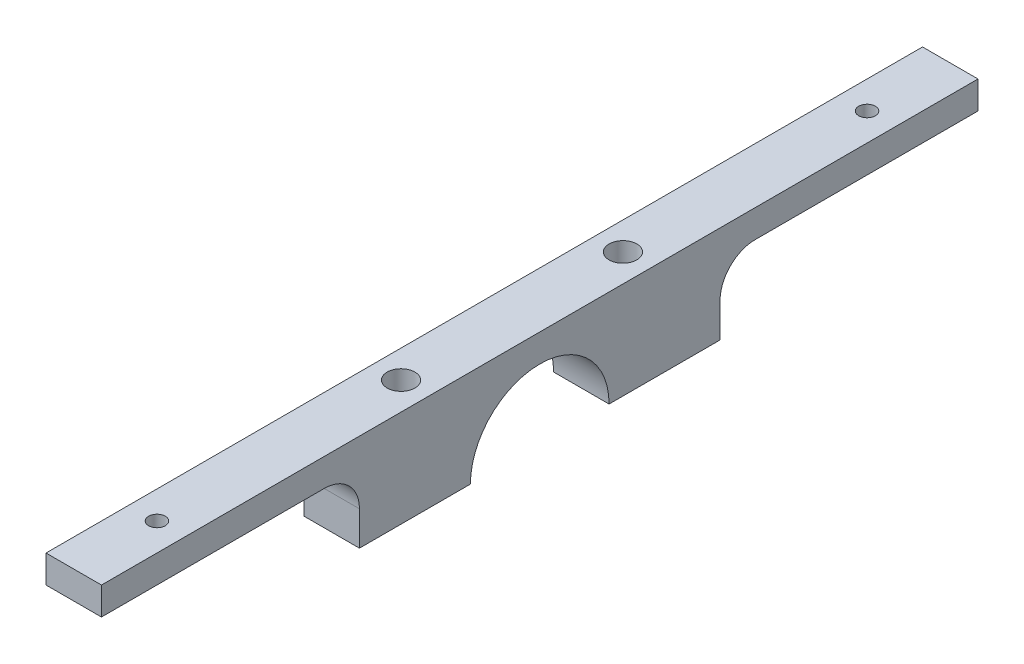
ISO-10303-21;
HEADER;
FILE_DESCRIPTION(('STEP AP214'),'2;1');
FILE_NAME('part.step','',(''),(''),'','','');
FILE_SCHEMA(('AUTOMOTIVE_DESIGN { 1 0 10303 214 1 1 1 1 }'));
ENDSEC;
DATA;
#1=APPLICATION_CONTEXT('core data for automotive mechanical design processes');
#2=APPLICATION_PROTOCOL_DEFINITION('international standard','automotive_design',2000,#1);
#3=PRODUCT_CONTEXT('',#1,'mechanical');
#4=PRODUCT('Part','Part','',(#3));
#5=PRODUCT_RELATED_PRODUCT_CATEGORY('part','',(#4));
#6=PRODUCT_DEFINITION_FORMATION('','',#4);
#7=PRODUCT_DEFINITION_CONTEXT('part definition',#1,'design');
#8=PRODUCT_DEFINITION('design','',#6,#7);
#9=PRODUCT_DEFINITION_SHAPE('','',#8);
#10=(LENGTH_UNIT() NAMED_UNIT(*) SI_UNIT(.MILLI.,.METRE.));
#11=(NAMED_UNIT(*) PLANE_ANGLE_UNIT() SI_UNIT($,.RADIAN.));
#12=(NAMED_UNIT(*) SI_UNIT($,.STERADIAN.) SOLID_ANGLE_UNIT());
#13=UNCERTAINTY_MEASURE_WITH_UNIT(LENGTH_MEASURE(1.E-05),#10,'distance_accuracy_value','');
#14=(GEOMETRIC_REPRESENTATION_CONTEXT(3) GLOBAL_UNCERTAINTY_ASSIGNED_CONTEXT((#13)) GLOBAL_UNIT_ASSIGNED_CONTEXT((#10,
#11,#12)) REPRESENTATION_CONTEXT('',''));
#15=CARTESIAN_POINT('',(0.,0.,0.));
#16=DIRECTION('',(0.,0.,1.));
#17=DIRECTION('',(1.,0.,0.));
#18=AXIS2_PLACEMENT_3D('',#15,#16,#17);
#19=CARTESIAN_POINT('',(10.,0.,0.));
#20=DIRECTION('',(-1.,0.,0.));
#21=DIRECTION('',(0.,0.,1.));
#22=AXIS2_PLACEMENT_3D('',#19,#20,#21);
#23=CYLINDRICAL_SURFACE('',#22,12.5);
#24=CARTESIAN_POINT('',(0.,0.,0.));
#25=DIRECTION('',(-1.,0.,0.));
#26=DIRECTION('',(0.,0.,-1.));
#27=AXIS2_PLACEMENT_3D('',#24,#25,#26);
#28=CIRCLE('',#27,12.5);
#29=CARTESIAN_POINT('',(0.,0.,12.5));
#30=VERTEX_POINT('',#29);
#31=CARTESIAN_POINT('',(0.,0.,-12.5));
#32=VERTEX_POINT('',#31);
#33=EDGE_CURVE('E161',#30,#32,#28,.T.);
#34=ORIENTED_EDGE('',*,*,#33,.T.);
#35=DIRECTION('',(-1.,0.,0.));
#36=VECTOR('',#35,1.);
#37=CARTESIAN_POINT('',(10.,0.,-12.5));
#38=LINE('',#37,#36);
#39=CARTESIAN_POINT('',(10.,0.,-12.5));
#40=VERTEX_POINT('',#39);
#41=EDGE_CURVE('E139',#40,#32,#38,.T.);
#42=ORIENTED_EDGE('',*,*,#41,.F.);
#43=CARTESIAN_POINT('',(10.,0.,0.));
#44=DIRECTION('',(-1.,0.,0.));
#45=DIRECTION('',(0.,0.,-1.));
#46=AXIS2_PLACEMENT_3D('',#43,#44,#45);
#47=CIRCLE('',#46,12.5);
#48=CARTESIAN_POINT('',(10.,0.,12.5));
#49=VERTEX_POINT('',#48);
#50=EDGE_CURVE('E148',#49,#40,#47,.T.);
#51=ORIENTED_EDGE('',*,*,#50,.F.);
#52=DIRECTION('',(-1.,0.,0.));
#53=VECTOR('',#52,1.);
#54=CARTESIAN_POINT('',(10.,0.,12.5));
#55=LINE('',#54,#53);
#56=EDGE_CURVE('E244',#49,#30,#55,.T.);
#57=ORIENTED_EDGE('',*,*,#56,.T.);
#58=EDGE_LOOP('',(#34,#42,#51,#57));
#59=FACE_BOUND('',#58,.T.);
#60=ADVANCED_FACE('F45',(#59),#23,.F.);
#61=CARTESIAN_POINT('',(10.,0.,-12.5));
#62=DIRECTION('',(0.,1.,0.));
#63=DIRECTION('',(0.,0.,1.));
#64=AXIS2_PLACEMENT_3D('',#61,#62,#63);
#65=PLANE('',#64);
#66=CARTESIAN_POINT('',(5.,0.,-20.));
#67=DIRECTION('',(0.,-1.,0.));
#68=DIRECTION('',(0.,0.,1.));
#69=AXIS2_PLACEMENT_3D('',#66,#67,#68);
#70=CIRCLE('',#69,2.5);
#71=CARTESIAN_POINT('',(5.,0.,-17.5));
#72=VERTEX_POINT('',#71);
#73=EDGE_CURVE('E310',#72,#72,#70,.T.);
#74=ORIENTED_EDGE('',*,*,#73,.F.);
#75=EDGE_LOOP('',(#74));
#76=FACE_BOUND('',#75,.T.);
#77=DIRECTION('',(0.,0.,-1.));
#78=VECTOR('',#77,1.);
#79=CARTESIAN_POINT('',(0.,0.,-12.5));
#80=LINE('',#79,#78);
#81=CARTESIAN_POINT('',(0.,0.,-32.5));
#82=VERTEX_POINT('',#81);
#83=EDGE_CURVE('E219',#32,#82,#80,.T.);
#84=ORIENTED_EDGE('',*,*,#83,.T.);
#85=DIRECTION('',(-1.,0.,0.));
#86=VECTOR('',#85,1.);
#87=CARTESIAN_POINT('',(10.,0.,-32.5));
#88=LINE('',#87,#86);
#89=CARTESIAN_POINT('',(10.,0.,-32.5));
#90=VERTEX_POINT('',#89);
#91=EDGE_CURVE('E142',#90,#82,#88,.T.);
#92=ORIENTED_EDGE('',*,*,#91,.F.);
#93=DIRECTION('',(0.,0.,-1.));
#94=VECTOR('',#93,1.);
#95=CARTESIAN_POINT('',(10.,0.,-12.5));
#96=LINE('',#95,#94);
#97=EDGE_CURVE('E135',#40,#90,#96,.T.);
#98=ORIENTED_EDGE('',*,*,#97,.F.);
#99=ORIENTED_EDGE('',*,*,#41,.T.);
#100=EDGE_LOOP('',(#84,#92,#98,#99));
#101=FACE_BOUND('',#100,.T.);
#102=ADVANCED_FACE('F137',(#76,#101),#65,.F.);
#103=CARTESIAN_POINT('',(10.,12.5,-32.5));
#104=DIRECTION('',(0.,0.,1.));
#105=DIRECTION('',(1.,0.,0.));
#106=AXIS2_PLACEMENT_3D('',#103,#104,#105);
#107=PLANE('',#106);
#108=DIRECTION('',(0.,1.,0.));
#109=VECTOR('',#108,1.);
#110=CARTESIAN_POINT('',(0.,12.5,-32.5));
#111=LINE('',#110,#109);
#112=CARTESIAN_POINT('',(0.,6.15000000000001,-32.5));
#113=VERTEX_POINT('',#112);
#114=EDGE_CURVE('E213',#82,#113,#111,.T.);
#115=ORIENTED_EDGE('',*,*,#114,.T.);
#116=DIRECTION('',(-1.,0.,0.));
#117=VECTOR('',#116,1.);
#118=CARTESIAN_POINT('',(10.,6.15000000000001,-32.5));
#119=LINE('',#118,#117);
#120=CARTESIAN_POINT('',(10.,6.15000000000001,-32.5));
#121=VERTEX_POINT('',#120);
#122=EDGE_CURVE('E168',#113,#121,#119,.F.);
#123=ORIENTED_EDGE('',*,*,#122,.T.);
#124=DIRECTION('',(0.,1.,0.));
#125=VECTOR('',#124,1.);
#126=CARTESIAN_POINT('',(10.,12.5,-32.5));
#127=LINE('',#126,#125);
#128=EDGE_CURVE('E147',#90,#121,#127,.T.);
#129=ORIENTED_EDGE('',*,*,#128,.F.);
#130=ORIENTED_EDGE('',*,*,#91,.T.);
#131=EDGE_LOOP('',(#115,#123,#129,#130));
#132=FACE_BOUND('',#131,.T.);
#133=ADVANCED_FACE('F217',(#132),#107,.F.);
#134=CARTESIAN_POINT('',(10.,12.5,-79.));
#135=DIRECTION('',(0.,1.,0.));
#136=DIRECTION('',(0.,0.,1.));
#137=AXIS2_PLACEMENT_3D('',#134,#135,#136);
#138=PLANE('',#137);
#139=CARTESIAN_POINT('',(5.,12.5,-64.));
#140=DIRECTION('',(0.,1.,0.));
#141=DIRECTION('',(0.,0.,1.));
#142=AXIS2_PLACEMENT_3D('',#139,#140,#141);
#143=CIRCLE('',#142,1.5);
#144=CARTESIAN_POINT('',(5.,12.5,-62.5));
#145=VERTEX_POINT('',#144);
#146=EDGE_CURVE('E177',#145,#145,#143,.T.);
#147=ORIENTED_EDGE('',*,*,#146,.T.);
#148=EDGE_LOOP('',(#147));
#149=FACE_BOUND('',#148,.T.);
#150=DIRECTION('',(0.,0.,-1.));
#151=VECTOR('',#150,1.);
#152=CARTESIAN_POINT('',(10.,12.5,-79.));
#153=LINE('',#152,#151);
#154=CARTESIAN_POINT('',(10.,12.5,-38.85));
#155=VERTEX_POINT('',#154);
#156=CARTESIAN_POINT('',(10.,12.5,-79.));
#157=VERTEX_POINT('',#156);
#158=EDGE_CURVE('E196',#155,#157,#153,.T.);
#159=ORIENTED_EDGE('',*,*,#158,.F.);
#160=DIRECTION('',(-1.,0.,0.));
#161=VECTOR('',#160,1.);
#162=CARTESIAN_POINT('',(0.,12.5,-38.85));
#163=LINE('',#162,#161);
#164=CARTESIAN_POINT('',(0.,12.5,-38.85));
#165=VERTEX_POINT('',#164);
#166=EDGE_CURVE('E163',#155,#165,#163,.T.);
#167=ORIENTED_EDGE('',*,*,#166,.T.);
#168=DIRECTION('',(0.,0.,-1.));
#169=VECTOR('',#168,1.);
#170=CARTESIAN_POINT('',(0.,12.5,-79.));
#171=LINE('',#170,#169);
#172=CARTESIAN_POINT('',(0.,12.5,-79.));
#173=VERTEX_POINT('',#172);
#174=EDGE_CURVE('E215',#165,#173,#171,.T.);
#175=ORIENTED_EDGE('',*,*,#174,.T.);
#176=DIRECTION('',(-1.,0.,0.));
#177=VECTOR('',#176,1.);
#178=CARTESIAN_POINT('',(10.,12.5,-79.));
#179=LINE('',#178,#177);
#180=EDGE_CURVE('E170',#157,#173,#179,.T.);
#181=ORIENTED_EDGE('',*,*,#180,.F.);
#182=EDGE_LOOP('',(#159,#167,#175,#181));
#183=FACE_BOUND('',#182,.T.);
#184=ADVANCED_FACE('F202',(#149,#183),#138,.F.);
#185=CARTESIAN_POINT('',(10.,12.5,-79.));
#186=DIRECTION('',(0.,0.,1.));
#187=DIRECTION('',(1.,0.,0.));
#188=AXIS2_PLACEMENT_3D('',#185,#186,#187);
#189=PLANE('',#188);
#190=DIRECTION('',(0.,1.,0.));
#191=VECTOR('',#190,1.);
#192=CARTESIAN_POINT('',(0.,12.5,-79.));
#193=LINE('',#192,#191);
#194=CARTESIAN_POINT('',(0.,17.5,-79.));
#195=VERTEX_POINT('',#194);
#196=EDGE_CURVE('E223',#173,#195,#193,.T.);
#197=ORIENTED_EDGE('',*,*,#196,.T.);
#198=DIRECTION('',(-1.,0.,0.));
#199=VECTOR('',#198,1.);
#200=CARTESIAN_POINT('',(10.,17.5,-79.));
#201=LINE('',#200,#199);
#202=CARTESIAN_POINT('',(10.,17.5,-79.));
#203=VERTEX_POINT('',#202);
#204=EDGE_CURVE('E259',#203,#195,#201,.T.);
#205=ORIENTED_EDGE('',*,*,#204,.F.);
#206=DIRECTION('',(0.,1.,0.));
#207=VECTOR('',#206,1.);
#208=CARTESIAN_POINT('',(10.,12.5,-79.));
#209=LINE('',#208,#207);
#210=EDGE_CURVE('E207',#157,#203,#209,.T.);
#211=ORIENTED_EDGE('',*,*,#210,.F.);
#212=ORIENTED_EDGE('',*,*,#180,.T.);
#213=EDGE_LOOP('',(#197,#205,#211,#212));
#214=FACE_BOUND('',#213,.T.);
#215=ADVANCED_FACE('F264',(#214),#189,.F.);
#216=CARTESIAN_POINT('',(10.,17.5,79.));
#217=DIRECTION('',(0.,-1.,0.));
#218=DIRECTION('',(0.,0.,-1.));
#219=AXIS2_PLACEMENT_3D('',#216,#217,#218);
#220=PLANE('',#219);
#221=CARTESIAN_POINT('',(5.,17.5,64.));
#222=DIRECTION('',(0.,-1.,0.));
#223=DIRECTION('',(0.,0.,-1.));
#224=AXIS2_PLACEMENT_3D('',#221,#222,#223);
#225=CIRCLE('',#224,1.5);
#226=CARTESIAN_POINT('',(5.,17.5,62.5));
#227=VERTEX_POINT('',#226);
#228=EDGE_CURVE('E178',#227,#227,#225,.T.);
#229=ORIENTED_EDGE('',*,*,#228,.T.);
#230=EDGE_LOOP('',(#229));
#231=FACE_BOUND('',#230,.T.);
#232=CARTESIAN_POINT('',(5.,17.5,-20.));
#233=DIRECTION('',(0.,-1.,0.));
#234=DIRECTION('',(0.,0.,1.));
#235=AXIS2_PLACEMENT_3D('',#232,#233,#234);
#236=CIRCLE('',#235,2.5);
#237=CARTESIAN_POINT('',(5.,17.5,-17.5));
#238=VERTEX_POINT('',#237);
#239=EDGE_CURVE('E317',#238,#238,#236,.T.);
#240=ORIENTED_EDGE('',*,*,#239,.T.);
#241=EDGE_LOOP('',(#240));
#242=FACE_BOUND('',#241,.T.);
#243=CARTESIAN_POINT('',(5.,17.5,20.));
#244=DIRECTION('',(0.,-1.,0.));
#245=DIRECTION('',(0.,0.,-1.));
#246=AXIS2_PLACEMENT_3D('',#243,#244,#245);
#247=CIRCLE('',#246,2.5);
#248=CARTESIAN_POINT('',(5.,17.5,17.5));
#249=VERTEX_POINT('',#248);
#250=EDGE_CURVE('E306',#249,#249,#247,.T.);
#251=ORIENTED_EDGE('',*,*,#250,.T.);
#252=EDGE_LOOP('',(#251));
#253=FACE_BOUND('',#252,.T.);
#254=CARTESIAN_POINT('',(5.,17.5,-64.));
#255=DIRECTION('',(0.,-1.,0.));
#256=DIRECTION('',(0.,0.,1.));
#257=AXIS2_PLACEMENT_3D('',#254,#255,#256);
#258=CIRCLE('',#257,1.5);
#259=CARTESIAN_POINT('',(5.,17.5,-62.5));
#260=VERTEX_POINT('',#259);
#261=EDGE_CURVE('E305',#260,#260,#258,.T.);
#262=ORIENTED_EDGE('',*,*,#261,.T.);
#263=EDGE_LOOP('',(#262));
#264=FACE_BOUND('',#263,.T.);
#265=DIRECTION('',(0.,0.,1.));
#266=VECTOR('',#265,1.);
#267=CARTESIAN_POINT('',(0.,17.5,79.));
#268=LINE('',#267,#266);
#269=CARTESIAN_POINT('',(0.,17.5,79.));
#270=VERTEX_POINT('',#269);
#271=EDGE_CURVE('E230',#195,#270,#268,.T.);
#272=ORIENTED_EDGE('',*,*,#271,.T.);
#273=DIRECTION('',(-1.,0.,0.));
#274=VECTOR('',#273,1.);
#275=CARTESIAN_POINT('',(10.,17.5,79.));
#276=LINE('',#275,#274);
#277=CARTESIAN_POINT('',(10.,17.5,79.));
#278=VERTEX_POINT('',#277);
#279=EDGE_CURVE('E255',#278,#270,#276,.T.);
#280=ORIENTED_EDGE('',*,*,#279,.F.);
#281=DIRECTION('',(0.,0.,1.));
#282=VECTOR('',#281,1.);
#283=CARTESIAN_POINT('',(10.,17.5,79.));
#284=LINE('',#283,#282);
#285=EDGE_CURVE('E279',#203,#278,#284,.T.);
#286=ORIENTED_EDGE('',*,*,#285,.F.);
#287=ORIENTED_EDGE('',*,*,#204,.T.);
#288=EDGE_LOOP('',(#272,#280,#286,#287));
#289=FACE_BOUND('',#288,.T.);
#290=ADVANCED_FACE('F270',(#231,#242,#253,#264,#289),#220,.F.);
#291=CARTESIAN_POINT('',(10.,12.5,79.));
#292=DIRECTION('',(0.,0.,-1.));
#293=DIRECTION('',(-1.,0.,0.));
#294=AXIS2_PLACEMENT_3D('',#291,#292,#293);
#295=PLANE('',#294);
#296=DIRECTION('',(0.,-1.,0.));
#297=VECTOR('',#296,1.);
#298=CARTESIAN_POINT('',(0.,12.5,79.));
#299=LINE('',#298,#297);
#300=CARTESIAN_POINT('',(0.,12.5,79.));
#301=VERTEX_POINT('',#300);
#302=EDGE_CURVE('E233',#270,#301,#299,.T.);
#303=ORIENTED_EDGE('',*,*,#302,.T.);
#304=DIRECTION('',(-1.,0.,0.));
#305=VECTOR('',#304,1.);
#306=CARTESIAN_POINT('',(10.,12.5,79.));
#307=LINE('',#306,#305);
#308=CARTESIAN_POINT('',(10.,12.5,79.));
#309=VERTEX_POINT('',#308);
#310=EDGE_CURVE('E251',#309,#301,#307,.T.);
#311=ORIENTED_EDGE('',*,*,#310,.F.);
#312=DIRECTION('',(0.,-1.,0.));
#313=VECTOR('',#312,1.);
#314=CARTESIAN_POINT('',(10.,12.5,79.));
#315=LINE('',#314,#313);
#316=EDGE_CURVE('E276',#278,#309,#315,.T.);
#317=ORIENTED_EDGE('',*,*,#316,.F.);
#318=ORIENTED_EDGE('',*,*,#279,.T.);
#319=EDGE_LOOP('',(#303,#311,#317,#318));
#320=FACE_BOUND('',#319,.T.);
#321=ADVANCED_FACE('F274',(#320),#295,.F.);
#322=CARTESIAN_POINT('',(10.,12.5,79.));
#323=DIRECTION('',(0.,1.,0.));
#324=DIRECTION('',(0.,0.,1.));
#325=AXIS2_PLACEMENT_3D('',#322,#323,#324);
#326=PLANE('',#325);
#327=CARTESIAN_POINT('',(5.,12.5,64.));
#328=DIRECTION('',(0.,1.,0.));
#329=DIRECTION('',(0.,0.,1.));
#330=AXIS2_PLACEMENT_3D('',#327,#328,#329);
#331=CIRCLE('',#330,1.5);
#332=CARTESIAN_POINT('',(5.,12.5,65.5));
#333=VERTEX_POINT('',#332);
#334=EDGE_CURVE('E174',#333,#333,#331,.T.);
#335=ORIENTED_EDGE('',*,*,#334,.T.);
#336=EDGE_LOOP('',(#335));
#337=FACE_BOUND('',#336,.T.);
#338=DIRECTION('',(0.,0.,-1.));
#339=VECTOR('',#338,1.);
#340=CARTESIAN_POINT('',(0.,12.5,79.));
#341=LINE('',#340,#339);
#342=CARTESIAN_POINT('',(0.,12.5,38.85));
#343=VERTEX_POINT('',#342);
#344=EDGE_CURVE('E236',#301,#343,#341,.T.);
#345=ORIENTED_EDGE('',*,*,#344,.T.);
#346=DIRECTION('',(-1.,0.,0.));
#347=VECTOR('',#346,1.);
#348=CARTESIAN_POINT('',(10.,12.5,38.85));
#349=LINE('',#348,#347);
#350=CARTESIAN_POINT('',(10.,12.5,38.85));
#351=VERTEX_POINT('',#350);
#352=EDGE_CURVE('E61',#343,#351,#349,.F.);
#353=ORIENTED_EDGE('',*,*,#352,.T.);
#354=DIRECTION('',(0.,0.,-1.));
#355=VECTOR('',#354,1.);
#356=CARTESIAN_POINT('',(10.,12.5,79.));
#357=LINE('',#356,#355);
#358=EDGE_CURVE('E278',#309,#351,#357,.T.);
#359=ORIENTED_EDGE('',*,*,#358,.F.);
#360=ORIENTED_EDGE('',*,*,#310,.T.);
#361=EDGE_LOOP('',(#345,#353,#359,#360));
#362=FACE_BOUND('',#361,.T.);
#363=ADVANCED_FACE('F335',(#337,#362),#326,.F.);
#364=CARTESIAN_POINT('',(10.,12.5,32.5));
#365=DIRECTION('',(0.,0.,-1.));
#366=DIRECTION('',(-1.,0.,0.));
#367=AXIS2_PLACEMENT_3D('',#364,#365,#366);
#368=PLANE('',#367);
#369=DIRECTION('',(0.,-1.,0.));
#370=VECTOR('',#369,1.);
#371=CARTESIAN_POINT('',(10.,12.5,32.5));
#372=LINE('',#371,#370);
#373=CARTESIAN_POINT('',(10.,6.15,32.5));
#374=VERTEX_POINT('',#373);
#375=CARTESIAN_POINT('',(10.,0.,32.5));
#376=VERTEX_POINT('',#375);
#377=EDGE_CURVE('E283',#374,#376,#372,.T.);
#378=ORIENTED_EDGE('',*,*,#377,.F.);
#379=DIRECTION('',(-1.,0.,0.));
#380=VECTOR('',#379,1.);
#381=CARTESIAN_POINT('',(0.,6.15,32.5));
#382=LINE('',#381,#380);
#383=CARTESIAN_POINT('',(0.,6.15,32.5));
#384=VERTEX_POINT('',#383);
#385=EDGE_CURVE('E182',#374,#384,#382,.T.);
#386=ORIENTED_EDGE('',*,*,#385,.T.);
#387=DIRECTION('',(0.,-1.,0.));
#388=VECTOR('',#387,1.);
#389=CARTESIAN_POINT('',(0.,12.5,32.5));
#390=LINE('',#389,#388);
#391=CARTESIAN_POINT('',(0.,0.,32.5));
#392=VERTEX_POINT('',#391);
#393=EDGE_CURVE('E239',#384,#392,#390,.T.);
#394=ORIENTED_EDGE('',*,*,#393,.T.);
#395=DIRECTION('',(-1.,0.,0.));
#396=VECTOR('',#395,1.);
#397=CARTESIAN_POINT('',(10.,0.,32.5));
#398=LINE('',#397,#396);
#399=EDGE_CURVE('E247',#376,#392,#398,.T.);
#400=ORIENTED_EDGE('',*,*,#399,.F.);
#401=EDGE_LOOP('',(#378,#386,#394,#400));
#402=FACE_BOUND('',#401,.T.);
#403=ADVANCED_FACE('F337',(#402),#368,.F.);
#404=CARTESIAN_POINT('',(10.,0.,32.5));
#405=DIRECTION('',(0.,1.,0.));
#406=DIRECTION('',(0.,0.,1.));
#407=AXIS2_PLACEMENT_3D('',#404,#405,#406);
#408=PLANE('',#407);
#409=CARTESIAN_POINT('',(5.,0.,20.));
#410=DIRECTION('',(0.,-1.,0.));
#411=DIRECTION('',(0.,0.,-1.));
#412=AXIS2_PLACEMENT_3D('',#409,#410,#411);
#413=CIRCLE('',#412,2.5);
#414=CARTESIAN_POINT('',(5.,0.,17.5));
#415=VERTEX_POINT('',#414);
#416=EDGE_CURVE('E298',#415,#415,#413,.T.);
#417=ORIENTED_EDGE('',*,*,#416,.F.);
#418=EDGE_LOOP('',(#417));
#419=FACE_BOUND('',#418,.T.);
#420=DIRECTION('',(0.,0.,-1.));
#421=VECTOR('',#420,1.);
#422=CARTESIAN_POINT('',(0.,0.,32.5));
#423=LINE('',#422,#421);
#424=EDGE_CURVE('E158',#392,#30,#423,.T.);
#425=ORIENTED_EDGE('',*,*,#424,.T.);
#426=ORIENTED_EDGE('',*,*,#56,.F.);
#427=DIRECTION('',(0.,0.,-1.));
#428=VECTOR('',#427,1.);
#429=CARTESIAN_POINT('',(10.,0.,32.5));
#430=LINE('',#429,#428);
#431=EDGE_CURVE('E153',#376,#49,#430,.T.);
#432=ORIENTED_EDGE('',*,*,#431,.F.);
#433=ORIENTED_EDGE('',*,*,#399,.T.);
#434=EDGE_LOOP('',(#425,#426,#432,#433));
#435=FACE_BOUND('',#434,.T.);
#436=ADVANCED_FACE('F347',(#419,#435),#408,.F.);
#437=CARTESIAN_POINT('',(10.,0.,0.));
#438=DIRECTION('',(1.,0.,0.));
#439=DIRECTION('',(0.,0.,-1.));
#440=AXIS2_PLACEMENT_3D('',#437,#438,#439);
#441=PLANE('',#440);
#442=ORIENTED_EDGE('',*,*,#50,.T.);
#443=ORIENTED_EDGE('',*,*,#97,.T.);
#444=ORIENTED_EDGE('',*,*,#128,.T.);
#445=CARTESIAN_POINT('',(10.,6.15000000000001,-38.85));
#446=DIRECTION('',(1.,0.,0.));
#447=DIRECTION('',(0.,0.,-1.));
#448=AXIS2_PLACEMENT_3D('',#445,#446,#447);
#449=CIRCLE('',#448,6.35);
#450=EDGE_CURVE('E191',#121,#155,#449,.F.);
#451=ORIENTED_EDGE('',*,*,#450,.T.);
#452=ORIENTED_EDGE('',*,*,#158,.T.);
#453=ORIENTED_EDGE('',*,*,#210,.T.);
#454=ORIENTED_EDGE('',*,*,#285,.T.);
#455=ORIENTED_EDGE('',*,*,#316,.T.);
#456=ORIENTED_EDGE('',*,*,#358,.T.);
#457=CARTESIAN_POINT('',(10.,6.15,38.85));
#458=DIRECTION('',(1.,0.,0.));
#459=DIRECTION('',(0.,0.,-1.));
#460=AXIS2_PLACEMENT_3D('',#457,#458,#459);
#461=CIRCLE('',#460,6.35);
#462=EDGE_CURVE('E11',#351,#374,#461,.F.);
#463=ORIENTED_EDGE('',*,*,#462,.T.);
#464=ORIENTED_EDGE('',*,*,#377,.T.);
#465=ORIENTED_EDGE('',*,*,#431,.T.);
#466=EDGE_LOOP('',(#442,#443,#444,#451,#452,#453,#454,#455,#456,#463,#464,#465));
#467=FACE_BOUND('',#466,.T.);
#468=ADVANCED_FACE('F151',(#467),#441,.T.);
#469=CARTESIAN_POINT('',(0.,0.,0.));
#470=DIRECTION('',(1.,0.,0.));
#471=DIRECTION('',(0.,0.,-1.));
#472=AXIS2_PLACEMENT_3D('',#469,#470,#471);
#473=PLANE('',#472);
#474=ORIENTED_EDGE('',*,*,#33,.F.);
#475=ORIENTED_EDGE('',*,*,#424,.F.);
#476=ORIENTED_EDGE('',*,*,#393,.F.);
#477=CARTESIAN_POINT('',(0.,6.15,38.85));
#478=DIRECTION('',(1.,0.,0.));
#479=DIRECTION('',(0.,0.,-1.));
#480=AXIS2_PLACEMENT_3D('',#477,#478,#479);
#481=CIRCLE('',#480,6.35);
#482=EDGE_CURVE('E54',#384,#343,#481,.T.);
#483=ORIENTED_EDGE('',*,*,#482,.T.);
#484=ORIENTED_EDGE('',*,*,#344,.F.);
#485=ORIENTED_EDGE('',*,*,#302,.F.);
#486=ORIENTED_EDGE('',*,*,#271,.F.);
#487=ORIENTED_EDGE('',*,*,#196,.F.);
#488=ORIENTED_EDGE('',*,*,#174,.F.);
#489=CARTESIAN_POINT('',(0.,6.15000000000001,-38.85));
#490=DIRECTION('',(1.,0.,0.));
#491=DIRECTION('',(0.,0.,-1.));
#492=AXIS2_PLACEMENT_3D('',#489,#490,#491);
#493=CIRCLE('',#492,6.35);
#494=EDGE_CURVE('E188',#165,#113,#493,.T.);
#495=ORIENTED_EDGE('',*,*,#494,.T.);
#496=ORIENTED_EDGE('',*,*,#114,.F.);
#497=ORIENTED_EDGE('',*,*,#83,.F.);
#498=EDGE_LOOP('',(#474,#475,#476,#483,#484,#485,#486,#487,#488,#495,#496,#497));
#499=FACE_BOUND('',#498,.T.);
#500=ADVANCED_FACE('F212',(#499),#473,.F.);
#501=CARTESIAN_POINT('',(5.,17.5,20.));
#502=DIRECTION('',(0.,-1.,0.));
#503=DIRECTION('',(0.,0.,-1.));
#504=AXIS2_PLACEMENT_3D('',#501,#502,#503);
#505=CYLINDRICAL_SURFACE('',#504,2.5);
#506=ORIENTED_EDGE('',*,*,#250,.F.);
#507=EDGE_LOOP('',(#506));
#508=FACE_BOUND('',#507,.T.);
#509=ORIENTED_EDGE('',*,*,#416,.T.);
#510=EDGE_LOOP('',(#509));
#511=FACE_BOUND('',#510,.T.);
#512=ADVANCED_FACE('F331',(#508,#511),#505,.F.);
#513=CARTESIAN_POINT('',(5.,17.5,64.));
#514=DIRECTION('',(0.,-1.,0.));
#515=DIRECTION('',(0.,0.,-1.));
#516=AXIS2_PLACEMENT_3D('',#513,#514,#515);
#517=CYLINDRICAL_SURFACE('',#516,1.5);
#518=ORIENTED_EDGE('',*,*,#228,.F.);
#519=EDGE_LOOP('',(#518));
#520=FACE_BOUND('',#519,.T.);
#521=ORIENTED_EDGE('',*,*,#334,.F.);
#522=EDGE_LOOP('',(#521));
#523=FACE_BOUND('',#522,.T.);
#524=ADVANCED_FACE('F327',(#520,#523),#517,.F.);
#525=CARTESIAN_POINT('',(5.,17.5,-64.));
#526=DIRECTION('',(0.,-1.,0.));
#527=DIRECTION('',(0.,0.,-1.));
#528=AXIS2_PLACEMENT_3D('',#525,#526,#527);
#529=CYLINDRICAL_SURFACE('',#528,1.5);
#530=ORIENTED_EDGE('',*,*,#261,.F.);
#531=EDGE_LOOP('',(#530));
#532=FACE_BOUND('',#531,.T.);
#533=ORIENTED_EDGE('',*,*,#146,.F.);
#534=EDGE_LOOP('',(#533));
#535=FACE_BOUND('',#534,.T.);
#536=ADVANCED_FACE('F330',(#532,#535),#529,.F.);
#537=CARTESIAN_POINT('',(5.,17.5,-20.));
#538=DIRECTION('',(0.,-1.,0.));
#539=DIRECTION('',(0.,0.,-1.));
#540=AXIS2_PLACEMENT_3D('',#537,#538,#539);
#541=CYLINDRICAL_SURFACE('',#540,2.5);
#542=ORIENTED_EDGE('',*,*,#239,.F.);
#543=EDGE_LOOP('',(#542));
#544=FACE_BOUND('',#543,.T.);
#545=ORIENTED_EDGE('',*,*,#73,.T.);
#546=EDGE_LOOP('',(#545));
#547=FACE_BOUND('',#546,.T.);
#548=ADVANCED_FACE('F371',(#544,#547),#541,.F.);
#549=CARTESIAN_POINT('',(10.,6.15000000000001,-38.85));
#550=DIRECTION('',(1.,0.,0.));
#551=DIRECTION('',(0.,0.,-1.));
#552=AXIS2_PLACEMENT_3D('',#549,#550,#551);
#553=CYLINDRICAL_SURFACE('',#552,6.35);
#554=ORIENTED_EDGE('',*,*,#450,.F.);
#555=ORIENTED_EDGE('',*,*,#122,.F.);
#556=ORIENTED_EDGE('',*,*,#494,.F.);
#557=ORIENTED_EDGE('',*,*,#166,.F.);
#558=EDGE_LOOP('',(#554,#555,#556,#557));
#559=FACE_BOUND('',#558,.T.);
#560=ADVANCED_FACE('F209',(#559),#553,.F.);
#561=CARTESIAN_POINT('',(10.,6.15,38.85));
#562=DIRECTION('',(1.,0.,0.));
#563=DIRECTION('',(0.,0.,-1.));
#564=AXIS2_PLACEMENT_3D('',#561,#562,#563);
#565=CYLINDRICAL_SURFACE('',#564,6.35);
#566=ORIENTED_EDGE('',*,*,#462,.F.);
#567=ORIENTED_EDGE('',*,*,#352,.F.);
#568=ORIENTED_EDGE('',*,*,#482,.F.);
#569=ORIENTED_EDGE('',*,*,#385,.F.);
#570=EDGE_LOOP('',(#566,#567,#568,#569));
#571=FACE_BOUND('',#570,.T.);
#572=ADVANCED_FACE('F47',(#571),#565,.F.);
#573=CLOSED_SHELL('',(#60,#102,#133,#184,#215,#290,#321,#363,#403,#436,#468,#500,#512,#524,#536,
#548,#560,#572));
#574=MANIFOLD_SOLID_BREP('B2',#573);
#575=ADVANCED_BREP_SHAPE_REPRESENTATION('',(#18,#574),#14);
#576=SHAPE_DEFINITION_REPRESENTATION(#9,#575);
ENDSEC;
END-ISO-10303-21;
